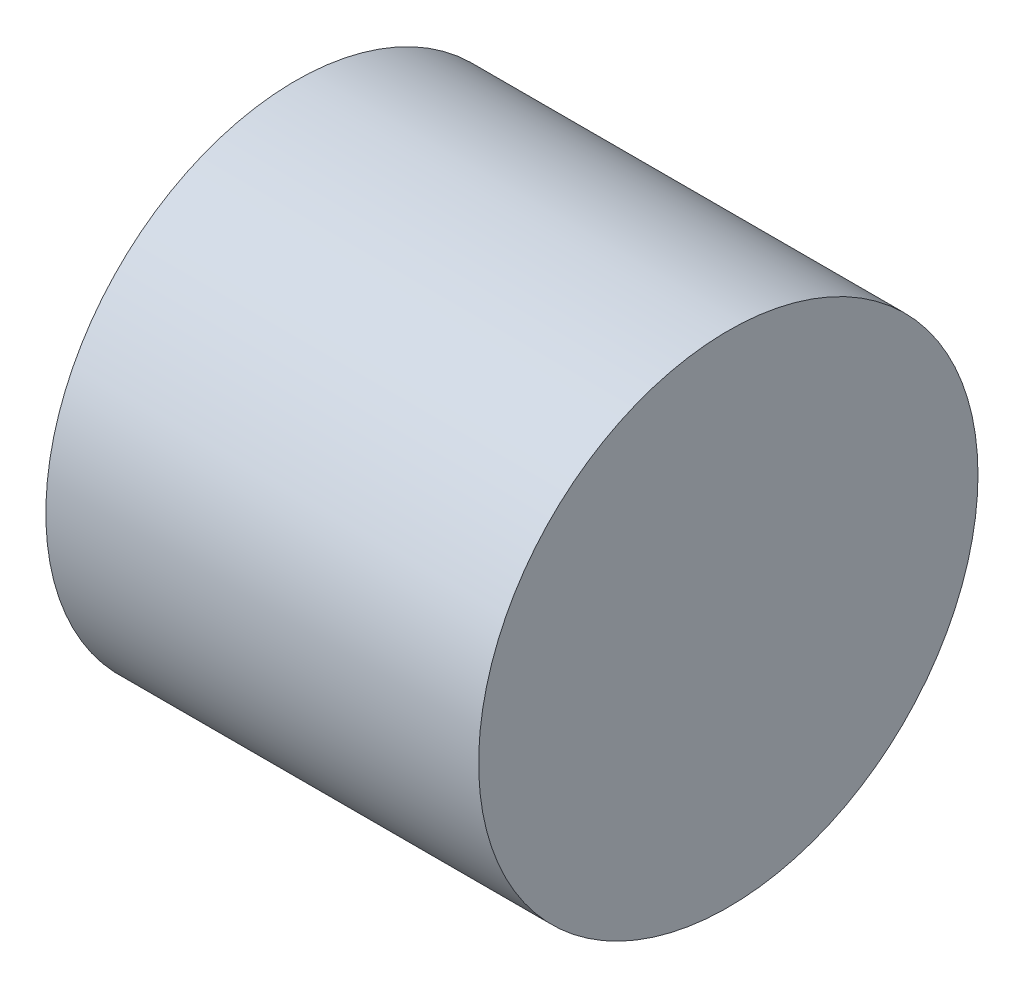
ISO-10303-21;
HEADER;
FILE_DESCRIPTION(('STEP AP214'),'2;1');
FILE_NAME('part.step','',(''),(''),'','','');
FILE_SCHEMA(('AUTOMOTIVE_DESIGN { 1 0 10303 214 1 1 1 1 }'));
ENDSEC;
DATA;
#1=APPLICATION_CONTEXT('core data for automotive mechanical design processes');
#2=APPLICATION_PROTOCOL_DEFINITION('international standard','automotive_design',2000,#1);
#3=PRODUCT_CONTEXT('',#1,'mechanical');
#4=PRODUCT('Part','Part','',(#3));
#5=PRODUCT_RELATED_PRODUCT_CATEGORY('part','',(#4));
#6=PRODUCT_DEFINITION_FORMATION('','',#4);
#7=PRODUCT_DEFINITION_CONTEXT('part definition',#1,'design');
#8=PRODUCT_DEFINITION('design','',#6,#7);
#9=PRODUCT_DEFINITION_SHAPE('','',#8);
#10=(LENGTH_UNIT() NAMED_UNIT(*) SI_UNIT(.MILLI.,.METRE.));
#11=(NAMED_UNIT(*) PLANE_ANGLE_UNIT() SI_UNIT($,.RADIAN.));
#12=(NAMED_UNIT(*) SI_UNIT($,.STERADIAN.) SOLID_ANGLE_UNIT());
#13=UNCERTAINTY_MEASURE_WITH_UNIT(LENGTH_MEASURE(1.E-05),#10,'distance_accuracy_value','');
#14=(GEOMETRIC_REPRESENTATION_CONTEXT(3) GLOBAL_UNCERTAINTY_ASSIGNED_CONTEXT((#13)) GLOBAL_UNIT_ASSIGNED_CONTEXT((#10,
#11,#12)) REPRESENTATION_CONTEXT('',''));
#15=CARTESIAN_POINT('',(0.,0.,0.));
#16=DIRECTION('',(0.,0.,1.));
#17=DIRECTION('',(1.,0.,0.));
#18=AXIS2_PLACEMENT_3D('',#15,#16,#17);
#19=CARTESIAN_POINT('',(10.,21.0123476945098,21.386323928833));
#20=DIRECTION('',(-1.,0.,0.));
#21=DIRECTION('',(0.,0.,1.));
#22=AXIS2_PLACEMENT_3D('',#19,#20,#21);
#23=CYLINDRICAL_SURFACE('',#22,5.7693528958049);
#24=CARTESIAN_POINT('',(10.,21.0123476945098,21.386323928833));
#25=DIRECTION('',(1.,0.,0.));
#26=DIRECTION('',(0.,0.,-1.));
#27=AXIS2_PLACEMENT_3D('',#24,#25,#26);
#28=CIRCLE('',#27,5.7693528958049);
#29=CARTESIAN_POINT('',(10.,21.0123476945098,15.6169710330281));
#30=VERTEX_POINT('',#29);
#31=EDGE_CURVE('E10',#30,#30,#28,.T.);
#32=ORIENTED_EDGE('',*,*,#31,.F.);
#33=EDGE_LOOP('',(#32));
#34=FACE_BOUND('',#33,.T.);
#35=CARTESIAN_POINT('',(0.,21.0123476945098,21.386323928833));
#36=DIRECTION('',(1.,0.,0.));
#37=DIRECTION('',(0.,0.,-1.));
#38=AXIS2_PLACEMENT_3D('',#35,#36,#37);
#39=CIRCLE('',#38,5.7693528958049);
#40=CARTESIAN_POINT('',(0.,21.0123476945098,15.6169710330281));
#41=VERTEX_POINT('',#40);
#42=EDGE_CURVE('E40',#41,#41,#39,.T.);
#43=ORIENTED_EDGE('',*,*,#42,.T.);
#44=EDGE_LOOP('',(#43));
#45=FACE_BOUND('',#44,.T.);
#46=ADVANCED_FACE('F37',(#34,#45),#23,.T.);
#47=CARTESIAN_POINT('',(10.,21.0123476945098,21.386323928833));
#48=DIRECTION('',(1.,0.,0.));
#49=DIRECTION('',(0.,0.,-1.));
#50=AXIS2_PLACEMENT_3D('',#47,#48,#49);
#51=PLANE('',#50);
#52=ORIENTED_EDGE('',*,*,#31,.T.);
#53=EDGE_LOOP('',(#52));
#54=FACE_BOUND('',#53,.T.);
#55=ADVANCED_FACE('F54',(#54),#51,.T.);
#56=CARTESIAN_POINT('',(0.,21.0123476945098,21.386323928833));
#57=DIRECTION('',(1.,0.,0.));
#58=DIRECTION('',(0.,0.,-1.));
#59=AXIS2_PLACEMENT_3D('',#56,#57,#58);
#60=PLANE('',#59);
#61=ORIENTED_EDGE('',*,*,#42,.F.);
#62=EDGE_LOOP('',(#61));
#63=FACE_BOUND('',#62,.T.);
#64=ADVANCED_FACE('F52',(#63),#60,.F.);
#65=CLOSED_SHELL('',(#46,#55,#64));
#66=MANIFOLD_SOLID_BREP('B2',#65);
#67=ADVANCED_BREP_SHAPE_REPRESENTATION('',(#18,#66),#14);
#68=SHAPE_DEFINITION_REPRESENTATION(#9,#67);
ENDSEC;
END-ISO-10303-21;
